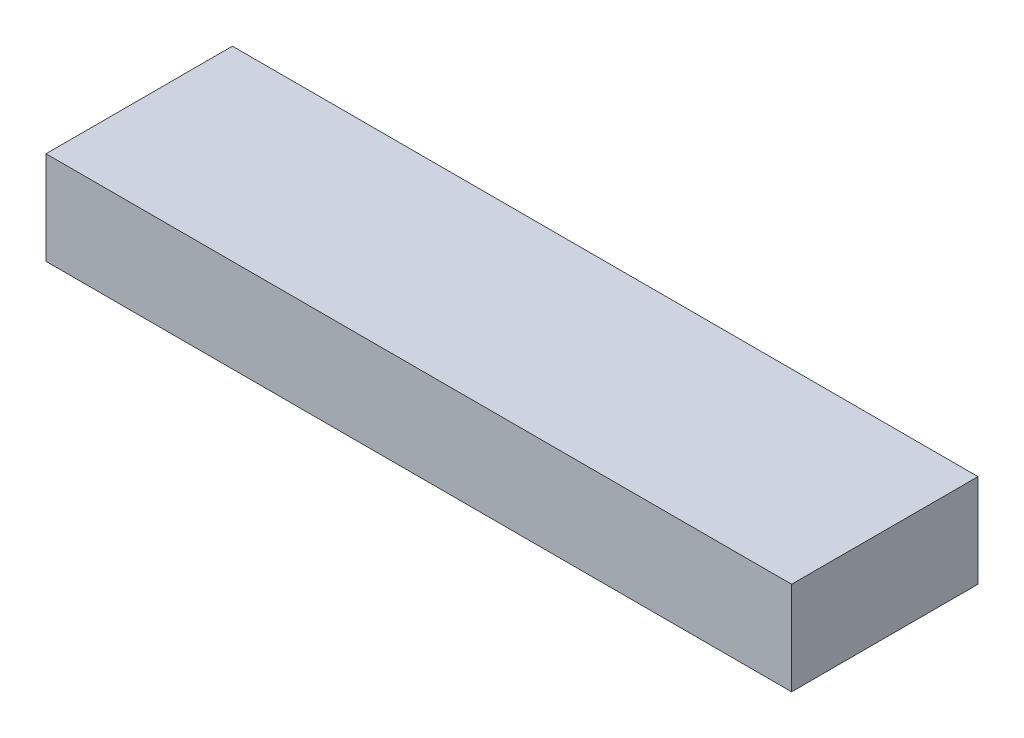
ISO-10303-21;
HEADER;
FILE_DESCRIPTION(('STEP AP214'),'2;1');
FILE_NAME('part.step','',(''),(''),'','','');
FILE_SCHEMA(('AUTOMOTIVE_DESIGN { 1 0 10303 214 1 1 1 1 }'));
ENDSEC;
DATA;
#1=APPLICATION_CONTEXT('core data for automotive mechanical design processes');
#2=APPLICATION_PROTOCOL_DEFINITION('international standard','automotive_design',2000,#1);
#3=PRODUCT_CONTEXT('',#1,'mechanical');
#4=PRODUCT('Part','Part','',(#3));
#5=PRODUCT_RELATED_PRODUCT_CATEGORY('part','',(#4));
#6=PRODUCT_DEFINITION_FORMATION('','',#4);
#7=PRODUCT_DEFINITION_CONTEXT('part definition',#1,'design');
#8=PRODUCT_DEFINITION('design','',#6,#7);
#9=PRODUCT_DEFINITION_SHAPE('','',#8);
#10=(LENGTH_UNIT() NAMED_UNIT(*) SI_UNIT(.MILLI.,.METRE.));
#11=(NAMED_UNIT(*) PLANE_ANGLE_UNIT() SI_UNIT($,.RADIAN.));
#12=(NAMED_UNIT(*) SI_UNIT($,.STERADIAN.) SOLID_ANGLE_UNIT());
#13=UNCERTAINTY_MEASURE_WITH_UNIT(LENGTH_MEASURE(1.E-05),#10,'distance_accuracy_value','');
#14=(GEOMETRIC_REPRESENTATION_CONTEXT(3) GLOBAL_UNCERTAINTY_ASSIGNED_CONTEXT((#13)) GLOBAL_UNIT_ASSIGNED_CONTEXT((#10,
#11,#12)) REPRESENTATION_CONTEXT('',''));
#15=CARTESIAN_POINT('',(0.,0.,0.));
#16=DIRECTION('',(0.,0.,1.));
#17=DIRECTION('',(1.,0.,0.));
#18=AXIS2_PLACEMENT_3D('',#15,#16,#17);
#19=CARTESIAN_POINT('',(-74.5775287704422,15.,-17.9527559055118));
#20=DIRECTION('',(1.,0.,0.));
#21=DIRECTION('',(0.,0.,-1.));
#22=AXIS2_PLACEMENT_3D('',#19,#20,#21);
#23=PLANE('',#22);
#24=DIRECTION('',(0.,0.,1.));
#25=VECTOR('',#24,1.);
#26=CARTESIAN_POINT('',(-74.5775287704422,0.,-17.9527559055118));
#27=LINE('',#26,#25);
#28=CARTESIAN_POINT('',(-74.5775287704422,0.,-17.9527559055118));
#29=VERTEX_POINT('',#28);
#30=CARTESIAN_POINT('',(-74.5775287704422,0.,12.0472440944882));
#31=VERTEX_POINT('',#30);
#32=EDGE_CURVE('E96',#29,#31,#27,.T.);
#33=ORIENTED_EDGE('',*,*,#32,.T.);
#34=DIRECTION('',(0.,-1.,0.));
#35=VECTOR('',#34,1.);
#36=CARTESIAN_POINT('',(-74.5775287704422,15.,12.0472440944882));
#37=LINE('',#36,#35);
#38=CARTESIAN_POINT('',(-74.5775287704422,15.,12.0472440944882));
#39=VERTEX_POINT('',#38);
#40=EDGE_CURVE('E11',#39,#31,#37,.T.);
#41=ORIENTED_EDGE('',*,*,#40,.F.);
#42=DIRECTION('',(0.,0.,1.));
#43=VECTOR('',#42,1.);
#44=CARTESIAN_POINT('',(-74.5775287704422,15.,-17.9527559055118));
#45=LINE('',#44,#43);
#46=CARTESIAN_POINT('',(-74.5775287704422,15.,-17.9527559055118));
#47=VERTEX_POINT('',#46);
#48=EDGE_CURVE('E84',#47,#39,#45,.T.);
#49=ORIENTED_EDGE('',*,*,#48,.F.);
#50=DIRECTION('',(0.,-1.,0.));
#51=VECTOR('',#50,1.);
#52=CARTESIAN_POINT('',(-74.5775287704422,15.,-17.9527559055118));
#53=LINE('',#52,#51);
#54=EDGE_CURVE('E92',#47,#29,#53,.T.);
#55=ORIENTED_EDGE('',*,*,#54,.T.);
#56=EDGE_LOOP('',(#33,#41,#49,#55));
#57=FACE_BOUND('',#56,.T.);
#58=ADVANCED_FACE('F33',(#57),#23,.F.);
#59=CARTESIAN_POINT('',(-74.5775287704422,15.,12.0472440944882));
#60=DIRECTION('',(0.,0.,-1.));
#61=DIRECTION('',(-1.,0.,0.));
#62=AXIS2_PLACEMENT_3D('',#59,#60,#61);
#63=PLANE('',#62);
#64=DIRECTION('',(1.,0.,0.));
#65=VECTOR('',#64,1.);
#66=CARTESIAN_POINT('',(-74.5775287704422,0.,12.0472440944882));
#67=LINE('',#66,#65);
#68=CARTESIAN_POINT('',(45.4224712295578,0.,12.0472440944882));
#69=VERTEX_POINT('',#68);
#70=EDGE_CURVE('E88',#31,#69,#67,.T.);
#71=ORIENTED_EDGE('',*,*,#70,.T.);
#72=DIRECTION('',(0.,-1.,0.));
#73=VECTOR('',#72,1.);
#74=CARTESIAN_POINT('',(45.4224712295578,15.,12.0472440944882));
#75=LINE('',#74,#73);
#76=CARTESIAN_POINT('',(45.4224712295578,15.,12.0472440944882));
#77=VERTEX_POINT('',#76);
#78=EDGE_CURVE('E41',#77,#69,#75,.T.);
#79=ORIENTED_EDGE('',*,*,#78,.F.);
#80=DIRECTION('',(1.,0.,0.));
#81=VECTOR('',#80,1.);
#82=CARTESIAN_POINT('',(-74.5775287704422,15.,12.0472440944882));
#83=LINE('',#82,#81);
#84=EDGE_CURVE('E79',#39,#77,#83,.T.);
#85=ORIENTED_EDGE('',*,*,#84,.F.);
#86=ORIENTED_EDGE('',*,*,#40,.T.);
#87=EDGE_LOOP('',(#71,#79,#85,#86));
#88=FACE_BOUND('',#87,.T.);
#89=ADVANCED_FACE('F87',(#88),#63,.F.);
#90=CARTESIAN_POINT('',(45.4224712295578,15.,-17.9527559055118));
#91=DIRECTION('',(-1.,0.,0.));
#92=DIRECTION('',(0.,0.,1.));
#93=AXIS2_PLACEMENT_3D('',#90,#91,#92);
#94=PLANE('',#93);
#95=DIRECTION('',(0.,0.,-1.));
#96=VECTOR('',#95,1.);
#97=CARTESIAN_POINT('',(45.4224712295578,0.,-17.9527559055118));
#98=LINE('',#97,#96);
#99=CARTESIAN_POINT('',(45.4224712295578,0.,-17.9527559055118));
#100=VERTEX_POINT('',#99);
#101=EDGE_CURVE('E66',#69,#100,#98,.T.);
#102=ORIENTED_EDGE('',*,*,#101,.T.);
#103=DIRECTION('',(0.,-1.,0.));
#104=VECTOR('',#103,1.);
#105=CARTESIAN_POINT('',(45.4224712295578,15.,-17.9527559055118));
#106=LINE('',#105,#104);
#107=CARTESIAN_POINT('',(45.4224712295578,15.,-17.9527559055118));
#108=VERTEX_POINT('',#107);
#109=EDGE_CURVE('E89',#108,#100,#106,.T.);
#110=ORIENTED_EDGE('',*,*,#109,.F.);
#111=DIRECTION('',(0.,0.,-1.));
#112=VECTOR('',#111,1.);
#113=CARTESIAN_POINT('',(45.4224712295578,15.,-17.9527559055118));
#114=LINE('',#113,#112);
#115=EDGE_CURVE('E82',#77,#108,#114,.T.);
#116=ORIENTED_EDGE('',*,*,#115,.F.);
#117=ORIENTED_EDGE('',*,*,#78,.T.);
#118=EDGE_LOOP('',(#102,#110,#116,#117));
#119=FACE_BOUND('',#118,.T.);
#120=ADVANCED_FACE('F90',(#119),#94,.F.);
#121=CARTESIAN_POINT('',(-74.5775287704422,15.,-17.9527559055118));
#122=DIRECTION('',(0.,0.,1.));
#123=DIRECTION('',(1.,0.,0.));
#124=AXIS2_PLACEMENT_3D('',#121,#122,#123);
#125=PLANE('',#124);
#126=DIRECTION('',(-1.,0.,0.));
#127=VECTOR('',#126,1.);
#128=CARTESIAN_POINT('',(-74.5775287704422,0.,-17.9527559055118));
#129=LINE('',#128,#127);
#130=EDGE_CURVE('E72',#100,#29,#129,.T.);
#131=ORIENTED_EDGE('',*,*,#130,.T.);
#132=ORIENTED_EDGE('',*,*,#54,.F.);
#133=DIRECTION('',(-1.,0.,0.));
#134=VECTOR('',#133,1.);
#135=CARTESIAN_POINT('',(-74.5775287704422,15.,-17.9527559055118));
#136=LINE('',#135,#134);
#137=EDGE_CURVE('E49',#108,#47,#136,.T.);
#138=ORIENTED_EDGE('',*,*,#137,.F.);
#139=ORIENTED_EDGE('',*,*,#109,.T.);
#140=EDGE_LOOP('',(#131,#132,#138,#139));
#141=FACE_BOUND('',#140,.T.);
#142=ADVANCED_FACE('F103',(#141),#125,.F.);
#143=CARTESIAN_POINT('',(0.,15.,0.));
#144=DIRECTION('',(0.,1.,0.));
#145=DIRECTION('',(0.,0.,1.));
#146=AXIS2_PLACEMENT_3D('',#143,#144,#145);
#147=PLANE('',#146);
#148=ORIENTED_EDGE('',*,*,#48,.T.);
#149=ORIENTED_EDGE('',*,*,#84,.T.);
#150=ORIENTED_EDGE('',*,*,#115,.T.);
#151=ORIENTED_EDGE('',*,*,#137,.T.);
#152=EDGE_LOOP('',(#148,#149,#150,#151));
#153=FACE_BOUND('',#152,.T.);
#154=ADVANCED_FACE('F80',(#153),#147,.T.);
#155=CARTESIAN_POINT('',(0.,0.,0.));
#156=DIRECTION('',(0.,1.,0.));
#157=DIRECTION('',(0.,0.,1.));
#158=AXIS2_PLACEMENT_3D('',#155,#156,#157);
#159=PLANE('',#158);
#160=ORIENTED_EDGE('',*,*,#32,.F.);
#161=ORIENTED_EDGE('',*,*,#130,.F.);
#162=ORIENTED_EDGE('',*,*,#101,.F.);
#163=ORIENTED_EDGE('',*,*,#70,.F.);
#164=EDGE_LOOP('',(#160,#161,#162,#163));
#165=FACE_BOUND('',#164,.T.);
#166=ADVANCED_FACE('F106',(#165),#159,.F.);
#167=CLOSED_SHELL('',(#58,#89,#120,#142,#154,#166));
#168=MANIFOLD_SOLID_BREP('B2',#167);
#169=ADVANCED_BREP_SHAPE_REPRESENTATION('',(#18,#168),#14);
#170=SHAPE_DEFINITION_REPRESENTATION(#9,#169);
ENDSEC;
END-ISO-10303-21;
